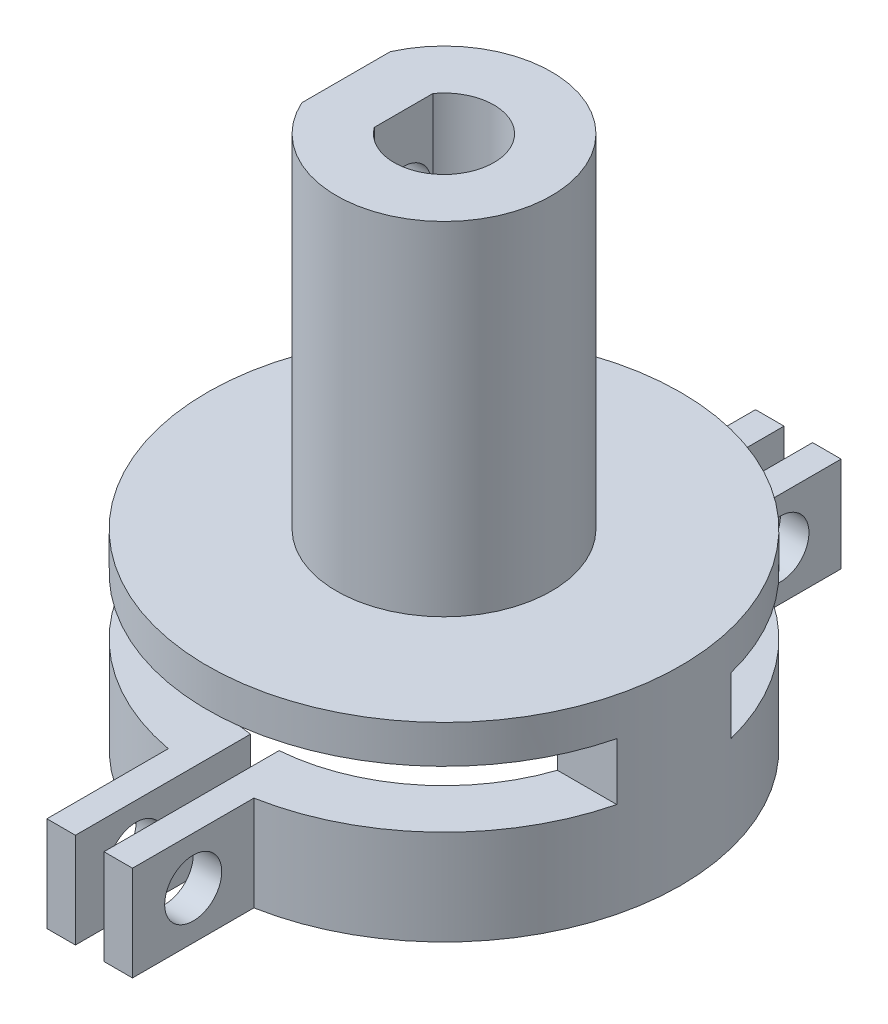
ISO-10303-21;
HEADER;
FILE_DESCRIPTION(('STEP AP214'),'2;1');
FILE_NAME('part.step','',(''),(''),'','','');
FILE_SCHEMA(('AUTOMOTIVE_DESIGN { 1 0 10303 214 1 1 1 1 }'));
ENDSEC;
DATA;
#1=APPLICATION_CONTEXT('core data for automotive mechanical design processes');
#2=APPLICATION_PROTOCOL_DEFINITION('international standard','automotive_design',2000,#1);
#3=PRODUCT_CONTEXT('',#1,'mechanical');
#4=PRODUCT('Part','Part','',(#3));
#5=PRODUCT_RELATED_PRODUCT_CATEGORY('part','',(#4));
#6=PRODUCT_DEFINITION_FORMATION('','',#4);
#7=PRODUCT_DEFINITION_CONTEXT('part definition',#1,'design');
#8=PRODUCT_DEFINITION('design','',#6,#7);
#9=PRODUCT_DEFINITION_SHAPE('','',#8);
#10=(LENGTH_UNIT() NAMED_UNIT(*) SI_UNIT(.MILLI.,.METRE.));
#11=(NAMED_UNIT(*) PLANE_ANGLE_UNIT() SI_UNIT($,.RADIAN.));
#12=(NAMED_UNIT(*) SI_UNIT($,.STERADIAN.) SOLID_ANGLE_UNIT());
#13=UNCERTAINTY_MEASURE_WITH_UNIT(LENGTH_MEASURE(1.E-05),#10,'distance_accuracy_value','');
#14=(GEOMETRIC_REPRESENTATION_CONTEXT(3) GLOBAL_UNCERTAINTY_ASSIGNED_CONTEXT((#13)) GLOBAL_UNIT_ASSIGNED_CONTEXT((#10,
#11,#12)) REPRESENTATION_CONTEXT('',''));
#15=CARTESIAN_POINT('',(0.,0.,0.));
#16=DIRECTION('',(0.,0.,1.));
#17=DIRECTION('',(1.,0.,0.));
#18=AXIS2_PLACEMENT_3D('',#15,#16,#17);
#19=CARTESIAN_POINT('',(0.,-2.,0.));
#20=DIRECTION('',(0.,1.,0.));
#21=DIRECTION('',(0.,0.,1.));
#22=AXIS2_PLACEMENT_3D('',#19,#20,#21);
#23=CYLINDRICAL_SURFACE('',#22,12.45);
#24=CARTESIAN_POINT('',(0.,0.,0.));
#25=DIRECTION('',(0.,-1.,0.));
#26=DIRECTION('',(0.,0.,-1.));
#27=AXIS2_PLACEMENT_3D('',#24,#25,#26);
#28=CIRCLE('',#27,12.45);
#29=CARTESIAN_POINT('',(0.,0.,-12.45));
#30=VERTEX_POINT('',#29);
#31=EDGE_CURVE('E424',#30,#30,#28,.T.);
#32=ORIENTED_EDGE('',*,*,#31,.T.);
#33=EDGE_LOOP('',(#32));
#34=FACE_BOUND('',#33,.T.);
#35=CARTESIAN_POINT('',(0.,-10.,0.));
#36=DIRECTION('',(0.,-1.,0.));
#37=DIRECTION('',(0.,0.,-1.));
#38=AXIS2_PLACEMENT_3D('',#35,#36,#37);
#39=CIRCLE('',#38,12.45);
#40=CARTESIAN_POINT('',(2.25000000000001,-10.,-12.2449989791751));
#41=VERTEX_POINT('',#40);
#42=CARTESIAN_POINT('',(2.25000000000001,-10.,12.2449989791751));
#43=VERTEX_POINT('',#42);
#44=EDGE_CURVE('E423',#41,#43,#39,.T.);
#45=ORIENTED_EDGE('',*,*,#44,.F.);
#46=DIRECTION('',(0.,-1.,0.));
#47=VECTOR('',#46,1.);
#48=CARTESIAN_POINT('',(2.25000000000001,1.55628734385074,-12.2449989791751));
#49=LINE('',#48,#47);
#50=CARTESIAN_POINT('',(2.25000000000001,-5.,-12.2449989791751));
#51=VERTEX_POINT('',#50);
#52=EDGE_CURVE('E269',#51,#41,#49,.T.);
#53=ORIENTED_EDGE('',*,*,#52,.F.);
#54=CARTESIAN_POINT('',(0.,-5.,0.));
#55=DIRECTION('',(0.,-1.,0.));
#56=DIRECTION('',(0.,0.,-1.));
#57=AXIS2_PLACEMENT_3D('',#54,#55,#56);
#58=CIRCLE('',#57,12.45);
#59=CARTESIAN_POINT('',(12.0831494238878,-5.,-3.));
#60=VERTEX_POINT('',#59);
#61=EDGE_CURVE('E401',#51,#60,#58,.T.);
#62=ORIENTED_EDGE('',*,*,#61,.T.);
#63=DIRECTION('',(0.,1.,0.));
#64=VECTOR('',#63,1.);
#65=CARTESIAN_POINT('',(12.0831494238878,-5.,-3.));
#66=LINE('',#65,#64);
#67=CARTESIAN_POINT('',(12.0831494238878,-2.,-3.));
#68=VERTEX_POINT('',#67);
#69=EDGE_CURVE('E386',#60,#68,#66,.T.);
#70=ORIENTED_EDGE('',*,*,#69,.T.);
#71=CARTESIAN_POINT('',(0.,-2.,0.));
#72=DIRECTION('',(0.,-1.,0.));
#73=DIRECTION('',(0.,0.,-1.));
#74=AXIS2_PLACEMENT_3D('',#71,#72,#73);
#75=CIRCLE('',#74,12.45);
#76=CARTESIAN_POINT('',(-12.0831494238878,-2.,-3.));
#77=VERTEX_POINT('',#76);
#78=EDGE_CURVE('E396',#77,#68,#75,.T.);
#79=ORIENTED_EDGE('',*,*,#78,.F.);
#80=DIRECTION('',(0.,1.,0.));
#81=VECTOR('',#80,1.);
#82=CARTESIAN_POINT('',(-12.0831494238878,-5.,-3.));
#83=LINE('',#82,#81);
#84=CARTESIAN_POINT('',(-12.0831494238878,-5.,-3.));
#85=VERTEX_POINT('',#84);
#86=EDGE_CURVE('E389',#85,#77,#83,.T.);
#87=ORIENTED_EDGE('',*,*,#86,.F.);
#88=CARTESIAN_POINT('',(-2.25,-5.,-12.2449989791751));
#89=VERTEX_POINT('',#88);
#90=EDGE_CURVE('E65',#85,#89,#58,.T.);
#91=ORIENTED_EDGE('',*,*,#90,.T.);
#92=DIRECTION('',(0.,-1.,0.));
#93=VECTOR('',#92,1.);
#94=CARTESIAN_POINT('',(-2.25,1.55628734385074,-12.2449989791751));
#95=LINE('',#94,#93);
#96=CARTESIAN_POINT('',(-2.25,-10.,-12.2449989791751));
#97=VERTEX_POINT('',#96);
#98=EDGE_CURVE('E60',#89,#97,#95,.T.);
#99=ORIENTED_EDGE('',*,*,#98,.T.);
#100=CARTESIAN_POINT('',(-2.25,-10.,12.2449989791751));
#101=VERTEX_POINT('',#100);
#102=EDGE_CURVE('E422',#101,#97,#39,.T.);
#103=ORIENTED_EDGE('',*,*,#102,.F.);
#104=DIRECTION('',(0.,-1.,0.));
#105=VECTOR('',#104,1.);
#106=CARTESIAN_POINT('',(-2.25,1.55628734385074,12.2449989791751));
#107=LINE('',#106,#105);
#108=CARTESIAN_POINT('',(-2.25,-5.,12.2449989791751));
#109=VERTEX_POINT('',#108);
#110=EDGE_CURVE('E325',#109,#101,#107,.T.);
#111=ORIENTED_EDGE('',*,*,#110,.F.);
#112=CARTESIAN_POINT('',(0.,-5.,0.));
#113=DIRECTION('',(0.,-1.,0.));
#114=DIRECTION('',(0.,0.,-1.));
#115=AXIS2_PLACEMENT_3D('',#112,#113,#114);
#116=CIRCLE('',#115,12.45);
#117=CARTESIAN_POINT('',(-12.0831494238878,-5.,3.00000000000001));
#118=VERTEX_POINT('',#117);
#119=EDGE_CURVE('E357',#109,#118,#116,.T.);
#120=ORIENTED_EDGE('',*,*,#119,.T.);
#121=DIRECTION('',(0.,1.,0.));
#122=VECTOR('',#121,1.);
#123=CARTESIAN_POINT('',(-12.0831494238878,-5.,3.00000000000001));
#124=LINE('',#123,#122);
#125=CARTESIAN_POINT('',(-12.0831494238878,-2.,3.00000000000001));
#126=VERTEX_POINT('',#125);
#127=EDGE_CURVE('E377',#118,#126,#124,.T.);
#128=ORIENTED_EDGE('',*,*,#127,.T.);
#129=CARTESIAN_POINT('',(0.,-2.,0.));
#130=DIRECTION('',(0.,-1.,0.));
#131=DIRECTION('',(0.,0.,-1.));
#132=AXIS2_PLACEMENT_3D('',#129,#130,#131);
#133=CIRCLE('',#132,12.45);
#134=CARTESIAN_POINT('',(12.0831494238878,-2.,3.));
#135=VERTEX_POINT('',#134);
#136=EDGE_CURVE('E365',#135,#126,#133,.T.);
#137=ORIENTED_EDGE('',*,*,#136,.F.);
#138=DIRECTION('',(0.,1.,0.));
#139=VECTOR('',#138,1.);
#140=CARTESIAN_POINT('',(12.0831494238878,-5.,3.));
#141=LINE('',#140,#139);
#142=CARTESIAN_POINT('',(12.0831494238878,-5.,3.));
#143=VERTEX_POINT('',#142);
#144=EDGE_CURVE('E375',#143,#135,#141,.T.);
#145=ORIENTED_EDGE('',*,*,#144,.F.);
#146=CARTESIAN_POINT('',(2.25000000000001,-5.,12.2449989791751));
#147=VERTEX_POINT('',#146);
#148=EDGE_CURVE('E358',#143,#147,#116,.T.);
#149=ORIENTED_EDGE('',*,*,#148,.T.);
#150=DIRECTION('',(0.,-1.,0.));
#151=VECTOR('',#150,1.);
#152=CARTESIAN_POINT('',(2.25000000000001,1.55628734385074,12.2449989791751));
#153=LINE('',#152,#151);
#154=EDGE_CURVE('E302',#147,#43,#153,.T.);
#155=ORIENTED_EDGE('',*,*,#154,.T.);
#156=EDGE_LOOP('',(#45,#53,#62,#70,#79,#87,#91,#99,#103,#111,#120,#128,#137,#145,#149,#155));
#157=FACE_BOUND('',#156,.T.);
#158=ADVANCED_FACE('F43',(#34,#157),#23,.T.);
#159=CARTESIAN_POINT('',(0.,-10.,0.));
#160=DIRECTION('',(0.,1.,0.));
#161=DIRECTION('',(0.,0.,1.));
#162=AXIS2_PLACEMENT_3D('',#159,#160,#161);
#163=CYLINDRICAL_SURFACE('',#162,9.45);
#164=DIRECTION('',(0.,-1.,0.));
#165=VECTOR('',#164,1.);
#166=CARTESIAN_POINT('',(0.75,18.001,-9.42019108086455));
#167=LINE('',#166,#165);
#168=CARTESIAN_POINT('',(0.75,-5.,-9.42019108086455));
#169=VERTEX_POINT('',#168);
#170=CARTESIAN_POINT('',(0.75,-10.,-9.42019108086455));
#171=VERTEX_POINT('',#170);
#172=EDGE_CURVE('E333',#169,#171,#167,.T.);
#173=ORIENTED_EDGE('',*,*,#172,.T.);
#174=CARTESIAN_POINT('',(0.,-10.,0.));
#175=DIRECTION('',(0.,-1.,0.));
#176=DIRECTION('',(0.,0.,-1.));
#177=AXIS2_PLACEMENT_3D('',#174,#175,#176);
#178=CIRCLE('',#177,9.45);
#179=CARTESIAN_POINT('',(0.75,-10.,9.42019108086455));
#180=VERTEX_POINT('',#179);
#181=EDGE_CURVE('E240',#171,#180,#178,.T.);
#182=ORIENTED_EDGE('',*,*,#181,.T.);
#183=DIRECTION('',(0.,-1.,0.));
#184=VECTOR('',#183,1.);
#185=CARTESIAN_POINT('',(0.75,18.001,9.42019108086455));
#186=LINE('',#185,#184);
#187=CARTESIAN_POINT('',(0.75,-5.,9.42019108086455));
#188=VERTEX_POINT('',#187);
#189=EDGE_CURVE('E340',#188,#180,#186,.T.);
#190=ORIENTED_EDGE('',*,*,#189,.F.);
#191=CARTESIAN_POINT('',(0.,-5.,0.));
#192=DIRECTION('',(0.,-1.,0.));
#193=DIRECTION('',(0.,0.,-1.));
#194=AXIS2_PLACEMENT_3D('',#191,#192,#193);
#195=CIRCLE('',#194,9.45);
#196=CARTESIAN_POINT('',(8.96116621874631,-5.,3.));
#197=VERTEX_POINT('',#196);
#198=EDGE_CURVE('E350',#197,#188,#195,.T.);
#199=ORIENTED_EDGE('',*,*,#198,.F.);
#200=DIRECTION('',(0.,1.,0.));
#201=VECTOR('',#200,1.);
#202=CARTESIAN_POINT('',(8.96116621874631,-5.,3.));
#203=LINE('',#202,#201);
#204=CARTESIAN_POINT('',(8.96116621874631,-2.,3.));
#205=VERTEX_POINT('',#204);
#206=EDGE_CURVE('E371',#197,#205,#203,.T.);
#207=ORIENTED_EDGE('',*,*,#206,.T.);
#208=CARTESIAN_POINT('',(0.,-2.,0.));
#209=DIRECTION('',(0.,-1.,0.));
#210=DIRECTION('',(0.,0.,-1.));
#211=AXIS2_PLACEMENT_3D('',#208,#209,#210);
#212=CIRCLE('',#211,9.45);
#213=CARTESIAN_POINT('',(8.96116621874631,-2.,-3.));
#214=VERTEX_POINT('',#213);
#215=EDGE_CURVE('E52',#205,#214,#212,.F.);
#216=ORIENTED_EDGE('',*,*,#215,.T.);
#217=DIRECTION('',(0.,1.,0.));
#218=VECTOR('',#217,1.);
#219=CARTESIAN_POINT('',(8.96116621874631,-5.,-3.));
#220=LINE('',#219,#218);
#221=CARTESIAN_POINT('',(8.96116621874631,-5.,-3.));
#222=VERTEX_POINT('',#221);
#223=EDGE_CURVE('E382',#222,#214,#220,.T.);
#224=ORIENTED_EDGE('',*,*,#223,.F.);
#225=CARTESIAN_POINT('',(0.,-5.,0.));
#226=DIRECTION('',(0.,-1.,0.));
#227=DIRECTION('',(0.,0.,-1.));
#228=AXIS2_PLACEMENT_3D('',#225,#226,#227);
#229=CIRCLE('',#228,9.45);
#230=EDGE_CURVE('E406',#169,#222,#229,.T.);
#231=ORIENTED_EDGE('',*,*,#230,.F.);
#232=EDGE_LOOP('',(#173,#182,#190,#199,#207,#216,#224,#231));
#233=FACE_BOUND('',#232,.T.);
#234=ADVANCED_FACE('F505',(#233),#163,.F.);
#235=CARTESIAN_POINT('',(0.,-10.,0.));
#236=DIRECTION('',(0.,-1.,0.));
#237=DIRECTION('',(0.,0.,-1.));
#238=AXIS2_PLACEMENT_3D('',#235,#236,#237);
#239=PLANE('',#238);
#240=DIRECTION('',(0.,0.,1.));
#241=VECTOR('',#240,1.);
#242=CARTESIAN_POINT('',(0.75,-10.,-9.42019108086455));
#243=LINE('',#242,#241);
#244=CARTESIAN_POINT('',(0.75000000000001,-10.,-18.6273891063248));
#245=VERTEX_POINT('',#244);
#246=EDGE_CURVE('E231',#245,#171,#243,.T.);
#247=ORIENTED_EDGE('',*,*,#246,.F.);
#248=DIRECTION('',(1.,0.,0.));
#249=VECTOR('',#248,1.);
#250=CARTESIAN_POINT('',(0.,-10.,-18.6273891063248));
#251=LINE('',#250,#249);
#252=CARTESIAN_POINT('',(2.25000000000001,-10.,-18.6273891063248));
#253=VERTEX_POINT('',#252);
#254=EDGE_CURVE('E236',#245,#253,#251,.T.);
#255=ORIENTED_EDGE('',*,*,#254,.T.);
#256=DIRECTION('',(0.,0.,1.));
#257=VECTOR('',#256,1.);
#258=CARTESIAN_POINT('',(2.25,-10.,0.));
#259=LINE('',#258,#257);
#260=EDGE_CURVE('E255',#253,#41,#259,.T.);
#261=ORIENTED_EDGE('',*,*,#260,.T.);
#262=ORIENTED_EDGE('',*,*,#44,.T.);
#263=DIRECTION('',(0.,0.,-1.));
#264=VECTOR('',#263,1.);
#265=CARTESIAN_POINT('',(2.25,-10.,0.));
#266=LINE('',#265,#264);
#267=CARTESIAN_POINT('',(2.25000000000001,-10.,18.6273891063248));
#268=VERTEX_POINT('',#267);
#269=EDGE_CURVE('E280',#268,#43,#266,.T.);
#270=ORIENTED_EDGE('',*,*,#269,.F.);
#271=DIRECTION('',(1.,0.,0.));
#272=VECTOR('',#271,1.);
#273=CARTESIAN_POINT('',(0.,-10.,18.6273891063248));
#274=LINE('',#273,#272);
#275=CARTESIAN_POINT('',(0.75000000000001,-10.,18.6273891063248));
#276=VERTEX_POINT('',#275);
#277=EDGE_CURVE('E299',#276,#268,#274,.T.);
#278=ORIENTED_EDGE('',*,*,#277,.F.);
#279=DIRECTION('',(0.,0.,1.));
#280=VECTOR('',#279,1.);
#281=CARTESIAN_POINT('',(0.75,-10.,9.42019108086455));
#282=LINE('',#281,#280);
#283=EDGE_CURVE('E344',#180,#276,#282,.T.);
#284=ORIENTED_EDGE('',*,*,#283,.F.);
#285=ORIENTED_EDGE('',*,*,#181,.F.);
#286=EDGE_LOOP('',(#247,#255,#261,#262,#270,#278,#284,#285));
#287=FACE_BOUND('',#286,.T.);
#288=ADVANCED_FACE('F233',(#287),#239,.T.);
#289=CARTESIAN_POINT('',(0.,-5.,0.));
#290=DIRECTION('',(0.,-1.,0.));
#291=DIRECTION('',(0.,0.,-1.));
#292=AXIS2_PLACEMENT_3D('',#289,#290,#291);
#293=PLANE('',#292);
#294=ORIENTED_EDGE('',*,*,#61,.F.);
#295=DIRECTION('',(0.,0.,-1.));
#296=VECTOR('',#295,1.);
#297=CARTESIAN_POINT('',(2.25,-5.,0.));
#298=LINE('',#297,#296);
#299=CARTESIAN_POINT('',(2.25000000000001,-5.,-18.6273891063248));
#300=VERTEX_POINT('',#299);
#301=EDGE_CURVE('E266',#51,#300,#298,.T.);
#302=ORIENTED_EDGE('',*,*,#301,.T.);
#303=DIRECTION('',(-1.,0.,0.));
#304=VECTOR('',#303,1.);
#305=CARTESIAN_POINT('',(0.,-5.,-18.6273891063248));
#306=LINE('',#305,#304);
#307=CARTESIAN_POINT('',(0.75000000000001,-5.,-18.6273891063248));
#308=VERTEX_POINT('',#307);
#309=EDGE_CURVE('E271',#300,#308,#306,.T.);
#310=ORIENTED_EDGE('',*,*,#309,.T.);
#311=DIRECTION('',(0.,0.,-1.));
#312=VECTOR('',#311,1.);
#313=CARTESIAN_POINT('',(0.75,-5.,-9.42019108086455));
#314=LINE('',#313,#312);
#315=EDGE_CURVE('E250',#169,#308,#314,.T.);
#316=ORIENTED_EDGE('',*,*,#315,.F.);
#317=ORIENTED_EDGE('',*,*,#230,.T.);
#318=DIRECTION('',(-1.,0.,0.));
#319=VECTOR('',#318,1.);
#320=CARTESIAN_POINT('',(0.,-5.,-3.));
#321=LINE('',#320,#319);
#322=EDGE_CURVE('E403',#60,#222,#321,.T.);
#323=ORIENTED_EDGE('',*,*,#322,.F.);
#324=EDGE_LOOP('',(#294,#302,#310,#316,#317,#323));
#325=FACE_BOUND('',#324,.T.);
#326=ADVANCED_FACE('F482',(#325),#293,.F.);
#327=CARTESIAN_POINT('',(0.,-5.,0.));
#328=DIRECTION('',(0.,-1.,0.));
#329=DIRECTION('',(0.,0.,-1.));
#330=AXIS2_PLACEMENT_3D('',#327,#328,#329);
#331=PLANE('',#330);
#332=ORIENTED_EDGE('',*,*,#119,.F.);
#333=DIRECTION('',(0.,0.,1.));
#334=VECTOR('',#333,1.);
#335=CARTESIAN_POINT('',(-2.25,-5.,0.));
#336=LINE('',#335,#334);
#337=CARTESIAN_POINT('',(-2.25,-5.,18.6273891063248));
#338=VERTEX_POINT('',#337);
#339=EDGE_CURVE('E315',#109,#338,#336,.T.);
#340=ORIENTED_EDGE('',*,*,#339,.T.);
#341=DIRECTION('',(1.,0.,0.));
#342=VECTOR('',#341,1.);
#343=CARTESIAN_POINT('',(0.,-5.,18.6273891063248));
#344=LINE('',#343,#342);
#345=CARTESIAN_POINT('',(-0.75,-5.,18.6273891063248));
#346=VERTEX_POINT('',#345);
#347=EDGE_CURVE('E312',#338,#346,#344,.T.);
#348=ORIENTED_EDGE('',*,*,#347,.T.);
#349=DIRECTION('',(0.,0.,1.));
#350=VECTOR('',#349,1.);
#351=CARTESIAN_POINT('',(-0.75,-5.,9.42019108086455));
#352=LINE('',#351,#350);
#353=CARTESIAN_POINT('',(-0.749999999999998,-5.,9.42019108086455));
#354=VERTEX_POINT('',#353);
#355=EDGE_CURVE('E329',#354,#346,#352,.T.);
#356=ORIENTED_EDGE('',*,*,#355,.F.);
#357=CARTESIAN_POINT('',(-8.96116621874631,-5.,3.));
#358=VERTEX_POINT('',#357);
#359=EDGE_CURVE('E354',#354,#358,#195,.T.);
#360=ORIENTED_EDGE('',*,*,#359,.T.);
#361=DIRECTION('',(1.,0.,0.));
#362=VECTOR('',#361,1.);
#363=CARTESIAN_POINT('',(0.,-5.,3.));
#364=LINE('',#363,#362);
#365=EDGE_CURVE('E353',#118,#358,#364,.T.);
#366=ORIENTED_EDGE('',*,*,#365,.F.);
#367=EDGE_LOOP('',(#332,#340,#348,#356,#360,#366));
#368=FACE_BOUND('',#367,.T.);
#369=ADVANCED_FACE('F551',(#368),#331,.F.);
#370=DIRECTION('',(0.,-1.,0.));
#371=VECTOR('',#370,1.);
#372=CARTESIAN_POINT('',(-0.750000000000005,18.001,-9.42019108086455));
#373=LINE('',#372,#371);
#374=CARTESIAN_POINT('',(-0.750000000000005,-5.,-9.42019108086455));
#375=VERTEX_POINT('',#374);
#376=CARTESIAN_POINT('',(-0.750000000000005,-10.,-9.42019108086455));
#377=VERTEX_POINT('',#376);
#378=EDGE_CURVE('E334',#375,#377,#373,.T.);
#379=ORIENTED_EDGE('',*,*,#378,.F.);
#380=CARTESIAN_POINT('',(-8.96116621874631,-5.,-3.));
#381=VERTEX_POINT('',#380);
#382=EDGE_CURVE('E397',#381,#375,#229,.T.);
#383=ORIENTED_EDGE('',*,*,#382,.F.);
#384=DIRECTION('',(0.,1.,0.));
#385=VECTOR('',#384,1.);
#386=CARTESIAN_POINT('',(-8.96116621874631,-5.,-3.));
#387=LINE('',#386,#385);
#388=CARTESIAN_POINT('',(-8.96116621874631,-2.,-3.));
#389=VERTEX_POINT('',#388);
#390=EDGE_CURVE('E338',#381,#389,#387,.T.);
#391=ORIENTED_EDGE('',*,*,#390,.T.);
#392=CARTESIAN_POINT('',(-8.96116621874631,-2.,3.));
#393=VERTEX_POINT('',#392);
#394=EDGE_CURVE('E11',#389,#393,#212,.F.);
#395=ORIENTED_EDGE('',*,*,#394,.T.);
#396=DIRECTION('',(0.,1.,0.));
#397=VECTOR('',#396,1.);
#398=CARTESIAN_POINT('',(-8.96116621874631,-5.,3.));
#399=LINE('',#398,#397);
#400=EDGE_CURVE('E362',#358,#393,#399,.T.);
#401=ORIENTED_EDGE('',*,*,#400,.F.);
#402=ORIENTED_EDGE('',*,*,#359,.F.);
#403=DIRECTION('',(0.,-1.,0.));
#404=VECTOR('',#403,1.);
#405=CARTESIAN_POINT('',(-0.749999999999998,18.001,9.42019108086455));
#406=LINE('',#405,#404);
#407=CARTESIAN_POINT('',(-0.749999999999998,-10.,9.42019108086455));
#408=VERTEX_POINT('',#407);
#409=EDGE_CURVE('E341',#354,#408,#406,.T.);
#410=ORIENTED_EDGE('',*,*,#409,.T.);
#411=EDGE_CURVE('E412',#408,#377,#178,.T.);
#412=ORIENTED_EDGE('',*,*,#411,.T.);
#413=EDGE_LOOP('',(#379,#383,#391,#395,#401,#402,#410,#412));
#414=FACE_BOUND('',#413,.T.);
#415=ADVANCED_FACE('F531',(#414),#163,.F.);
#416=CARTESIAN_POINT('',(0.,18.,0.));
#417=DIRECTION('',(0.,1.,0.));
#418=DIRECTION('',(0.,0.,1.));
#419=AXIS2_PLACEMENT_3D('',#416,#417,#418);
#420=PLANE('',#419);
#421=CARTESIAN_POINT('',(0.,18.,0.));
#422=DIRECTION('',(0.,1.,0.));
#423=DIRECTION('',(0.,0.,1.));
#424=AXIS2_PLACEMENT_3D('',#421,#422,#423);
#425=CIRCLE('',#424,5.65);
#426=CARTESIAN_POINT('',(-5.14941852602047,18.,2.32507824467849));
#427=VERTEX_POINT('',#426);
#428=CARTESIAN_POINT('',(-5.14941852602047,18.,-2.32507824467849));
#429=VERTEX_POINT('',#428);
#430=EDGE_CURVE('E445',#427,#429,#425,.T.);
#431=ORIENTED_EDGE('',*,*,#430,.T.);
#432=DIRECTION('',(0.,0.,1.));
#433=VECTOR('',#432,1.);
#434=CARTESIAN_POINT('',(-5.14941852602047,18.,-2.32507824467849));
#435=LINE('',#434,#433);
#436=EDGE_CURVE('E448',#429,#427,#435,.T.);
#437=ORIENTED_EDGE('',*,*,#436,.T.);
#438=EDGE_LOOP('',(#431,#437));
#439=FACE_BOUND('',#438,.T.);
#440=DIRECTION('',(0.,0.,1.));
#441=VECTOR('',#440,1.);
#442=CARTESIAN_POINT('',(-2.12441852602047,18.,-1.54190496668926));
#443=LINE('',#442,#441);
#444=CARTESIAN_POINT('',(-2.12441852602047,18.,-1.54190496668926));
#445=VERTEX_POINT('',#444);
#446=CARTESIAN_POINT('',(-2.12441852602047,18.,1.54190496668926));
#447=VERTEX_POINT('',#446);
#448=EDGE_CURVE('E432',#445,#447,#443,.T.);
#449=ORIENTED_EDGE('',*,*,#448,.F.);
#450=CARTESIAN_POINT('',(0.,18.,0.));
#451=DIRECTION('',(0.,1.,0.));
#452=DIRECTION('',(0.,0.,1.));
#453=AXIS2_PLACEMENT_3D('',#450,#451,#452);
#454=CIRCLE('',#453,2.625);
#455=EDGE_CURVE('E429',#447,#445,#454,.T.);
#456=ORIENTED_EDGE('',*,*,#455,.F.);
#457=EDGE_LOOP('',(#449,#456));
#458=FACE_BOUND('',#457,.T.);
#459=ADVANCED_FACE('F588',(#439,#458),#420,.T.);
#460=CARTESIAN_POINT('',(0.,18.,0.));
#461=DIRECTION('',(0.,-1.,0.));
#462=DIRECTION('',(0.,0.,-1.));
#463=AXIS2_PLACEMENT_3D('',#460,#461,#462);
#464=CYLINDRICAL_SURFACE('',#463,5.65);
#465=CARTESIAN_POINT('',(0.,0.,0.));
#466=DIRECTION('',(0.,1.,0.));
#467=DIRECTION('',(0.,0.,1.));
#468=AXIS2_PLACEMENT_3D('',#465,#466,#467);
#469=CIRCLE('',#468,5.65);
#470=CARTESIAN_POINT('',(-5.14941852602047,0.,2.32507824467849));
#471=VERTEX_POINT('',#470);
#472=CARTESIAN_POINT('',(-5.14941852602047,0.,-2.32507824467849));
#473=VERTEX_POINT('',#472);
#474=EDGE_CURVE('E444',#471,#473,#469,.T.);
#475=ORIENTED_EDGE('',*,*,#474,.T.);
#476=DIRECTION('',(0.,-1.,0.));
#477=VECTOR('',#476,1.);
#478=CARTESIAN_POINT('',(-5.14941852602047,18.,-2.32507824467849));
#479=LINE('',#478,#477);
#480=EDGE_CURVE('E458',#429,#473,#479,.T.);
#481=ORIENTED_EDGE('',*,*,#480,.F.);
#482=ORIENTED_EDGE('',*,*,#430,.F.);
#483=DIRECTION('',(0.,-1.,0.));
#484=VECTOR('',#483,1.);
#485=CARTESIAN_POINT('',(-5.14941852602047,18.,2.32507824467849));
#486=LINE('',#485,#484);
#487=EDGE_CURVE('E451',#427,#471,#486,.T.);
#488=ORIENTED_EDGE('',*,*,#487,.T.);
#489=EDGE_LOOP('',(#475,#481,#482,#488));
#490=FACE_BOUND('',#489,.T.);
#491=ADVANCED_FACE('F45',(#490),#464,.T.);
#492=CARTESIAN_POINT('',(-5.14941852602047,18.,-2.32507824467849));
#493=DIRECTION('',(1.,0.,0.));
#494=DIRECTION('',(0.,0.,-1.));
#495=AXIS2_PLACEMENT_3D('',#492,#493,#494);
#496=PLANE('',#495);
#497=CARTESIAN_POINT('',(-5.14941852602047,14.,0.));
#498=DIRECTION('',(-1.,0.,0.));
#499=DIRECTION('',(0.,0.,1.));
#500=AXIS2_PLACEMENT_3D('',#497,#498,#499);
#501=CIRCLE('',#500,1.45);
#502=CARTESIAN_POINT('',(-5.14941852602047,14.,1.45));
#503=VERTEX_POINT('',#502);
#504=EDGE_CURVE('E409',#503,#503,#501,.T.);
#505=ORIENTED_EDGE('',*,*,#504,.F.);
#506=EDGE_LOOP('',(#505));
#507=FACE_BOUND('',#506,.T.);
#508=CARTESIAN_POINT('',(-5.14941852602047,4.,0.));
#509=DIRECTION('',(-1.,0.,0.));
#510=DIRECTION('',(0.,0.,1.));
#511=AXIS2_PLACEMENT_3D('',#508,#509,#510);
#512=CIRCLE('',#511,1.45);
#513=CARTESIAN_POINT('',(-5.14941852602047,4.,1.45));
#514=VERTEX_POINT('',#513);
#515=EDGE_CURVE('E374',#514,#514,#512,.T.);
#516=ORIENTED_EDGE('',*,*,#515,.F.);
#517=EDGE_LOOP('',(#516));
#518=FACE_BOUND('',#517,.T.);
#519=DIRECTION('',(0.,0.,1.));
#520=VECTOR('',#519,1.);
#521=CARTESIAN_POINT('',(-5.14941852602047,0.,-2.32507824467849));
#522=LINE('',#521,#520);
#523=EDGE_CURVE('E449',#473,#471,#522,.T.);
#524=ORIENTED_EDGE('',*,*,#523,.T.);
#525=ORIENTED_EDGE('',*,*,#487,.F.);
#526=ORIENTED_EDGE('',*,*,#436,.F.);
#527=ORIENTED_EDGE('',*,*,#480,.T.);
#528=EDGE_LOOP('',(#524,#525,#526,#527));
#529=FACE_BOUND('',#528,.T.);
#530=ADVANCED_FACE('F586',(#507,#518,#529),#496,.F.);
#531=CARTESIAN_POINT('',(0.,18.,0.));
#532=DIRECTION('',(0.,-1.,0.));
#533=DIRECTION('',(0.,0.,-1.));
#534=AXIS2_PLACEMENT_3D('',#531,#532,#533);
#535=CYLINDRICAL_SURFACE('',#534,2.625);
#536=CARTESIAN_POINT('',(0.,0.,0.));
#537=DIRECTION('',(0.,1.,0.));
#538=DIRECTION('',(0.,0.,1.));
#539=AXIS2_PLACEMENT_3D('',#536,#537,#538);
#540=CIRCLE('',#539,2.625);
#541=CARTESIAN_POINT('',(-2.12441852602047,0.,1.54190496668926));
#542=VERTEX_POINT('',#541);
#543=CARTESIAN_POINT('',(-2.12441852602047,0.,-1.54190496668926));
#544=VERTEX_POINT('',#543);
#545=EDGE_CURVE('E428',#542,#544,#540,.T.);
#546=ORIENTED_EDGE('',*,*,#545,.F.);
#547=DIRECTION('',(0.,-1.,0.));
#548=VECTOR('',#547,1.);
#549=CARTESIAN_POINT('',(-2.12441852602047,18.,1.54190496668926));
#550=LINE('',#549,#548);
#551=EDGE_CURVE('E435',#447,#542,#550,.T.);
#552=ORIENTED_EDGE('',*,*,#551,.F.);
#553=ORIENTED_EDGE('',*,*,#455,.T.);
#554=DIRECTION('',(0.,-1.,0.));
#555=VECTOR('',#554,1.);
#556=CARTESIAN_POINT('',(-2.12441852602047,18.,-1.54190496668926));
#557=LINE('',#556,#555);
#558=EDGE_CURVE('E441',#445,#544,#557,.T.);
#559=ORIENTED_EDGE('',*,*,#558,.T.);
#560=EDGE_LOOP('',(#546,#552,#553,#559));
#561=FACE_BOUND('',#560,.T.);
#562=ADVANCED_FACE('F582',(#561),#535,.F.);
#563=CARTESIAN_POINT('',(-2.12441852602047,18.,-1.54190496668926));
#564=DIRECTION('',(1.,0.,0.));
#565=DIRECTION('',(0.,0.,-1.));
#566=AXIS2_PLACEMENT_3D('',#563,#564,#565);
#567=PLANE('',#566);
#568=CARTESIAN_POINT('',(-2.12441852602047,14.,0.));
#569=DIRECTION('',(1.,0.,0.));
#570=DIRECTION('',(0.,0.,-1.));
#571=AXIS2_PLACEMENT_3D('',#568,#569,#570);
#572=CIRCLE('',#571,1.45);
#573=CARTESIAN_POINT('',(-2.12441852602047,14.,-1.45));
#574=VERTEX_POINT('',#573);
#575=EDGE_CURVE('E413',#574,#574,#572,.F.);
#576=ORIENTED_EDGE('',*,*,#575,.T.);
#577=EDGE_LOOP('',(#576));
#578=FACE_BOUND('',#577,.T.);
#579=CARTESIAN_POINT('',(-2.12441852602047,4.,0.));
#580=DIRECTION('',(1.,0.,0.));
#581=DIRECTION('',(0.,0.,-1.));
#582=AXIS2_PLACEMENT_3D('',#579,#580,#581);
#583=CIRCLE('',#582,1.45);
#584=CARTESIAN_POINT('',(-2.12441852602047,4.,-1.45));
#585=VERTEX_POINT('',#584);
#586=EDGE_CURVE('E416',#585,#585,#583,.F.);
#587=ORIENTED_EDGE('',*,*,#586,.T.);
#588=EDGE_LOOP('',(#587));
#589=FACE_BOUND('',#588,.T.);
#590=DIRECTION('',(0.,0.,1.));
#591=VECTOR('',#590,1.);
#592=CARTESIAN_POINT('',(-2.12441852602047,0.,-1.54190496668926));
#593=LINE('',#592,#591);
#594=EDGE_CURVE('E433',#544,#542,#593,.T.);
#595=ORIENTED_EDGE('',*,*,#594,.F.);
#596=ORIENTED_EDGE('',*,*,#558,.F.);
#597=ORIENTED_EDGE('',*,*,#448,.T.);
#598=ORIENTED_EDGE('',*,*,#551,.T.);
#599=EDGE_LOOP('',(#595,#596,#597,#598));
#600=FACE_BOUND('',#599,.T.);
#601=ADVANCED_FACE('F578',(#578,#589,#600),#567,.T.);
#602=CARTESIAN_POINT('',(0.,0.,0.));
#603=DIRECTION('',(0.,-1.,0.));
#604=DIRECTION('',(0.,0.,-1.));
#605=AXIS2_PLACEMENT_3D('',#602,#603,#604);
#606=PLANE('',#605);
#607=ORIENTED_EDGE('',*,*,#594,.T.);
#608=ORIENTED_EDGE('',*,*,#545,.T.);
#609=EDGE_LOOP('',(#607,#608));
#610=FACE_BOUND('',#609,.T.);
#611=ADVANCED_FACE('F581',(#610),#606,.F.);
#612=ORIENTED_EDGE('',*,*,#31,.F.);
#613=EDGE_LOOP('',(#612));
#614=FACE_BOUND('',#613,.T.);
#615=ORIENTED_EDGE('',*,*,#474,.F.);
#616=ORIENTED_EDGE('',*,*,#523,.F.);
#617=EDGE_LOOP('',(#615,#616));
#618=FACE_BOUND('',#617,.T.);
#619=ADVANCED_FACE('F576',(#614,#618),#606,.F.);
#620=DIRECTION('',(0.,0.,-1.));
#621=VECTOR('',#620,1.);
#622=CARTESIAN_POINT('',(-0.75,-10.,-9.42019108086455));
#623=LINE('',#622,#621);
#624=CARTESIAN_POINT('',(-0.75,-10.,-18.6273891063248));
#625=VERTEX_POINT('',#624);
#626=EDGE_CURVE('E243',#377,#625,#623,.T.);
#627=ORIENTED_EDGE('',*,*,#626,.F.);
#628=ORIENTED_EDGE('',*,*,#411,.F.);
#629=DIRECTION('',(0.,0.,-1.));
#630=VECTOR('',#629,1.);
#631=CARTESIAN_POINT('',(-0.75,-10.,9.42019108086455));
#632=LINE('',#631,#630);
#633=CARTESIAN_POINT('',(-0.75,-10.,18.6273891063248));
#634=VERTEX_POINT('',#633);
#635=EDGE_CURVE('E347',#634,#408,#632,.T.);
#636=ORIENTED_EDGE('',*,*,#635,.F.);
#637=DIRECTION('',(-1.,0.,0.));
#638=VECTOR('',#637,1.);
#639=CARTESIAN_POINT('',(0.,-10.,18.6273891063248));
#640=LINE('',#639,#638);
#641=CARTESIAN_POINT('',(-2.25,-10.,18.6273891063248));
#642=VERTEX_POINT('',#641);
#643=EDGE_CURVE('E295',#634,#642,#640,.T.);
#644=ORIENTED_EDGE('',*,*,#643,.T.);
#645=DIRECTION('',(0.,0.,-1.));
#646=VECTOR('',#645,1.);
#647=CARTESIAN_POINT('',(-2.25,-10.,0.));
#648=LINE('',#647,#646);
#649=EDGE_CURVE('E319',#642,#101,#648,.T.);
#650=ORIENTED_EDGE('',*,*,#649,.T.);
#651=ORIENTED_EDGE('',*,*,#102,.T.);
#652=DIRECTION('',(0.,0.,1.));
#653=VECTOR('',#652,1.);
#654=CARTESIAN_POINT('',(-2.25,-10.,0.));
#655=LINE('',#654,#653);
#656=CARTESIAN_POINT('',(-2.25,-10.,-18.6273891063248));
#657=VERTEX_POINT('',#656);
#658=EDGE_CURVE('E281',#657,#97,#655,.T.);
#659=ORIENTED_EDGE('',*,*,#658,.F.);
#660=DIRECTION('',(-1.,0.,0.));
#661=VECTOR('',#660,1.);
#662=CARTESIAN_POINT('',(0.,-10.,-18.6273891063248));
#663=LINE('',#662,#661);
#664=EDGE_CURVE('E284',#625,#657,#663,.T.);
#665=ORIENTED_EDGE('',*,*,#664,.F.);
#666=EDGE_LOOP('',(#627,#628,#636,#644,#650,#651,#659,#665));
#667=FACE_BOUND('',#666,.T.);
#668=ADVANCED_FACE('F543',(#667),#239,.T.);
#669=CARTESIAN_POINT('',(0.,-2.,0.));
#670=DIRECTION('',(0.,-1.,0.));
#671=DIRECTION('',(0.,0.,-1.));
#672=AXIS2_PLACEMENT_3D('',#669,#670,#671);
#673=PLANE('',#672);
#674=ORIENTED_EDGE('',*,*,#394,.F.);
#675=DIRECTION('',(-1.,0.,0.));
#676=VECTOR('',#675,1.);
#677=CARTESIAN_POINT('',(0.,-2.,-3.));
#678=LINE('',#677,#676);
#679=EDGE_CURVE('E393',#389,#77,#678,.T.);
#680=ORIENTED_EDGE('',*,*,#679,.T.);
#681=ORIENTED_EDGE('',*,*,#78,.T.);
#682=DIRECTION('',(-1.,0.,0.));
#683=VECTOR('',#682,1.);
#684=CARTESIAN_POINT('',(0.,-2.,-3.));
#685=LINE('',#684,#683);
#686=EDGE_CURVE('E366',#68,#214,#685,.T.);
#687=ORIENTED_EDGE('',*,*,#686,.T.);
#688=ORIENTED_EDGE('',*,*,#215,.F.);
#689=DIRECTION('',(1.,0.,0.));
#690=VECTOR('',#689,1.);
#691=CARTESIAN_POINT('',(0.,-2.,3.));
#692=LINE('',#691,#690);
#693=EDGE_CURVE('E368',#205,#135,#692,.T.);
#694=ORIENTED_EDGE('',*,*,#693,.T.);
#695=ORIENTED_EDGE('',*,*,#136,.T.);
#696=DIRECTION('',(1.,0.,0.));
#697=VECTOR('',#696,1.);
#698=CARTESIAN_POINT('',(0.,-2.,3.));
#699=LINE('',#698,#697);
#700=EDGE_CURVE('E363',#126,#393,#699,.T.);
#701=ORIENTED_EDGE('',*,*,#700,.T.);
#702=EDGE_LOOP('',(#674,#680,#681,#687,#688,#694,#695,#701));
#703=FACE_BOUND('',#702,.T.);
#704=ADVANCED_FACE('F516',(#703),#673,.T.);
#705=CARTESIAN_POINT('',(12.451,4.,0.));
#706=DIRECTION('',(-1.,0.,0.));
#707=DIRECTION('',(0.,0.,1.));
#708=AXIS2_PLACEMENT_3D('',#705,#706,#707);
#709=CYLINDRICAL_SURFACE('',#708,1.45);
#710=ORIENTED_EDGE('',*,*,#586,.F.);
#711=EDGE_LOOP('',(#710));
#712=FACE_BOUND('',#711,.T.);
#713=ORIENTED_EDGE('',*,*,#515,.T.);
#714=EDGE_LOOP('',(#713));
#715=FACE_BOUND('',#714,.T.);
#716=ADVANCED_FACE('F627',(#712,#715),#709,.F.);
#717=CARTESIAN_POINT('',(12.451,14.,0.));
#718=DIRECTION('',(-1.,0.,0.));
#719=DIRECTION('',(0.,0.,1.));
#720=AXIS2_PLACEMENT_3D('',#717,#718,#719);
#721=CYLINDRICAL_SURFACE('',#720,1.45);
#722=ORIENTED_EDGE('',*,*,#575,.F.);
#723=EDGE_LOOP('',(#722));
#724=FACE_BOUND('',#723,.T.);
#725=ORIENTED_EDGE('',*,*,#504,.T.);
#726=EDGE_LOOP('',(#725));
#727=FACE_BOUND('',#726,.T.);
#728=ADVANCED_FACE('F642',(#724,#727),#721,.F.);
#729=CARTESIAN_POINT('',(0.,-5.,-3.));
#730=DIRECTION('',(0.,0.,-1.));
#731=DIRECTION('',(-1.,0.,0.));
#732=AXIS2_PLACEMENT_3D('',#729,#730,#731);
#733=PLANE('',#732);
#734=ORIENTED_EDGE('',*,*,#679,.F.);
#735=ORIENTED_EDGE('',*,*,#390,.F.);
#736=DIRECTION('',(-1.,0.,0.));
#737=VECTOR('',#736,1.);
#738=CARTESIAN_POINT('',(0.,-5.,-3.));
#739=LINE('',#738,#737);
#740=EDGE_CURVE('E385',#381,#85,#739,.T.);
#741=ORIENTED_EDGE('',*,*,#740,.T.);
#742=ORIENTED_EDGE('',*,*,#86,.T.);
#743=EDGE_LOOP('',(#734,#735,#741,#742));
#744=FACE_BOUND('',#743,.T.);
#745=ADVANCED_FACE('F525',(#744),#733,.T.);
#746=CARTESIAN_POINT('',(0.,-5.,-3.));
#747=DIRECTION('',(0.,0.,-1.));
#748=DIRECTION('',(-1.,0.,0.));
#749=AXIS2_PLACEMENT_3D('',#746,#747,#748);
#750=PLANE('',#749);
#751=ORIENTED_EDGE('',*,*,#686,.F.);
#752=ORIENTED_EDGE('',*,*,#69,.F.);
#753=ORIENTED_EDGE('',*,*,#322,.T.);
#754=ORIENTED_EDGE('',*,*,#223,.T.);
#755=EDGE_LOOP('',(#751,#752,#753,#754));
#756=FACE_BOUND('',#755,.T.);
#757=ADVANCED_FACE('F522',(#756),#750,.T.);
#758=ORIENTED_EDGE('',*,*,#382,.T.);
#759=DIRECTION('',(0.,0.,1.));
#760=VECTOR('',#759,1.);
#761=CARTESIAN_POINT('',(-0.75,-5.,-9.42019108086455));
#762=LINE('',#761,#760);
#763=CARTESIAN_POINT('',(-0.75,-5.,-18.6273891063248));
#764=VERTEX_POINT('',#763);
#765=EDGE_CURVE('E244',#764,#375,#762,.T.);
#766=ORIENTED_EDGE('',*,*,#765,.F.);
#767=DIRECTION('',(1.,0.,0.));
#768=VECTOR('',#767,1.);
#769=CARTESIAN_POINT('',(0.,-5.,-18.6273891063248));
#770=LINE('',#769,#768);
#771=CARTESIAN_POINT('',(-2.25,-5.,-18.6273891063248));
#772=VERTEX_POINT('',#771);
#773=EDGE_CURVE('E276',#772,#764,#770,.T.);
#774=ORIENTED_EDGE('',*,*,#773,.F.);
#775=DIRECTION('',(0.,0.,-1.));
#776=VECTOR('',#775,1.);
#777=CARTESIAN_POINT('',(-2.25,-5.,0.));
#778=LINE('',#777,#776);
#779=EDGE_CURVE('E273',#89,#772,#778,.T.);
#780=ORIENTED_EDGE('',*,*,#779,.F.);
#781=ORIENTED_EDGE('',*,*,#90,.F.);
#782=ORIENTED_EDGE('',*,*,#740,.F.);
#783=EDGE_LOOP('',(#758,#766,#774,#780,#781,#782));
#784=FACE_BOUND('',#783,.T.);
#785=ADVANCED_FACE('F535',(#784),#293,.F.);
#786=CARTESIAN_POINT('',(0.,-5.,3.));
#787=DIRECTION('',(0.,0.,1.));
#788=DIRECTION('',(1.,0.,0.));
#789=AXIS2_PLACEMENT_3D('',#786,#787,#788);
#790=PLANE('',#789);
#791=ORIENTED_EDGE('',*,*,#693,.F.);
#792=ORIENTED_EDGE('',*,*,#206,.F.);
#793=DIRECTION('',(1.,0.,0.));
#794=VECTOR('',#793,1.);
#795=CARTESIAN_POINT('',(0.,-5.,3.));
#796=LINE('',#795,#794);
#797=EDGE_CURVE('E360',#197,#143,#796,.T.);
#798=ORIENTED_EDGE('',*,*,#797,.T.);
#799=ORIENTED_EDGE('',*,*,#144,.T.);
#800=EDGE_LOOP('',(#791,#792,#798,#799));
#801=FACE_BOUND('',#800,.T.);
#802=ADVANCED_FACE('F510',(#801),#790,.T.);
#803=CARTESIAN_POINT('',(0.,-5.,3.));
#804=DIRECTION('',(0.,0.,1.));
#805=DIRECTION('',(1.,0.,0.));
#806=AXIS2_PLACEMENT_3D('',#803,#804,#805);
#807=PLANE('',#806);
#808=ORIENTED_EDGE('',*,*,#700,.F.);
#809=ORIENTED_EDGE('',*,*,#127,.F.);
#810=ORIENTED_EDGE('',*,*,#365,.T.);
#811=ORIENTED_EDGE('',*,*,#400,.T.);
#812=EDGE_LOOP('',(#808,#809,#810,#811));
#813=FACE_BOUND('',#812,.T.);
#814=ADVANCED_FACE('F555',(#813),#807,.T.);
#815=ORIENTED_EDGE('',*,*,#198,.T.);
#816=DIRECTION('',(0.,0.,-1.));
#817=VECTOR('',#816,1.);
#818=CARTESIAN_POINT('',(0.75,-5.,9.42019108086455));
#819=LINE('',#818,#817);
#820=CARTESIAN_POINT('',(0.75000000000001,-5.,18.6273891063248));
#821=VERTEX_POINT('',#820);
#822=EDGE_CURVE('E330',#821,#188,#819,.T.);
#823=ORIENTED_EDGE('',*,*,#822,.F.);
#824=DIRECTION('',(-1.,0.,0.));
#825=VECTOR('',#824,1.);
#826=CARTESIAN_POINT('',(0.,-5.,18.6273891063248));
#827=LINE('',#826,#825);
#828=CARTESIAN_POINT('',(2.25000000000001,-5.,18.6273891063248));
#829=VERTEX_POINT('',#828);
#830=EDGE_CURVE('E292',#829,#821,#827,.T.);
#831=ORIENTED_EDGE('',*,*,#830,.F.);
#832=DIRECTION('',(0.,0.,1.));
#833=VECTOR('',#832,1.);
#834=CARTESIAN_POINT('',(2.25,-5.,0.));
#835=LINE('',#834,#833);
#836=EDGE_CURVE('E296',#147,#829,#835,.T.);
#837=ORIENTED_EDGE('',*,*,#836,.F.);
#838=ORIENTED_EDGE('',*,*,#148,.F.);
#839=ORIENTED_EDGE('',*,*,#797,.F.);
#840=EDGE_LOOP('',(#815,#823,#831,#837,#838,#839));
#841=FACE_BOUND('',#840,.T.);
#842=ADVANCED_FACE('F508',(#841),#331,.F.);
#843=CARTESIAN_POINT('',(0.75,18.001,9.42019108086455));
#844=DIRECTION('',(1.,0.,0.));
#845=DIRECTION('',(0.,0.,-1.));
#846=AXIS2_PLACEMENT_3D('',#843,#844,#845);
#847=PLANE('',#846);
#848=CARTESIAN_POINT('',(0.750000000000001,-7.5,15.43619404275));
#849=DIRECTION('',(1.,0.,0.));
#850=DIRECTION('',(0.,0.,-1.));
#851=AXIS2_PLACEMENT_3D('',#848,#849,#850);
#852=CIRCLE('',#851,1.5);
#853=CARTESIAN_POINT('',(0.750000000000001,-7.5,13.93619404275));
#854=VERTEX_POINT('',#853);
#855=EDGE_CURVE('E259',#854,#854,#852,.T.);
#856=ORIENTED_EDGE('',*,*,#855,.T.);
#857=EDGE_LOOP('',(#856));
#858=FACE_BOUND('',#857,.T.);
#859=ORIENTED_EDGE('',*,*,#822,.T.);
#860=ORIENTED_EDGE('',*,*,#189,.T.);
#861=ORIENTED_EDGE('',*,*,#283,.T.);
#862=DIRECTION('',(0.,-1.,0.));
#863=VECTOR('',#862,1.);
#864=CARTESIAN_POINT('',(0.75000000000001,1.55628734385074,18.6273891063248));
#865=LINE('',#864,#863);
#866=EDGE_CURVE('E303',#821,#276,#865,.T.);
#867=ORIENTED_EDGE('',*,*,#866,.F.);
#868=EDGE_LOOP('',(#859,#860,#861,#867));
#869=FACE_BOUND('',#868,.T.);
#870=ADVANCED_FACE('F501',(#858,#869),#847,.F.);
#871=CARTESIAN_POINT('',(-0.75,18.001,9.42019108086455));
#872=DIRECTION('',(-1.,0.,0.));
#873=DIRECTION('',(0.,0.,1.));
#874=AXIS2_PLACEMENT_3D('',#871,#872,#873);
#875=PLANE('',#874);
#876=CARTESIAN_POINT('',(-0.750000000000001,-7.5,15.43619404275));
#877=DIRECTION('',(-1.,0.,0.));
#878=DIRECTION('',(0.,0.,1.));
#879=AXIS2_PLACEMENT_3D('',#876,#877,#878);
#880=CIRCLE('',#879,1.5);
#881=CARTESIAN_POINT('',(-0.750000000000001,-7.5,16.93619404275));
#882=VERTEX_POINT('',#881);
#883=EDGE_CURVE('E263',#882,#882,#880,.T.);
#884=ORIENTED_EDGE('',*,*,#883,.T.);
#885=EDGE_LOOP('',(#884));
#886=FACE_BOUND('',#885,.T.);
#887=ORIENTED_EDGE('',*,*,#355,.T.);
#888=DIRECTION('',(0.,-1.,0.));
#889=VECTOR('',#888,1.);
#890=CARTESIAN_POINT('',(-0.75,1.55628734385074,18.6273891063248));
#891=LINE('',#890,#889);
#892=EDGE_CURVE('E316',#346,#634,#891,.T.);
#893=ORIENTED_EDGE('',*,*,#892,.T.);
#894=ORIENTED_EDGE('',*,*,#635,.T.);
#895=ORIENTED_EDGE('',*,*,#409,.F.);
#896=EDGE_LOOP('',(#887,#893,#894,#895));
#897=FACE_BOUND('',#896,.T.);
#898=ADVANCED_FACE('F679',(#886,#897),#875,.F.);
#899=CARTESIAN_POINT('',(-0.75,18.001,-9.42019108086455));
#900=DIRECTION('',(-1.,0.,0.));
#901=DIRECTION('',(0.,0.,1.));
#902=AXIS2_PLACEMENT_3D('',#899,#900,#901);
#903=PLANE('',#902);
#904=CARTESIAN_POINT('',(-0.750000000000001,-7.5,-15.43619404275));
#905=DIRECTION('',(-1.,0.,0.));
#906=DIRECTION('',(0.,0.,1.));
#907=AXIS2_PLACEMENT_3D('',#904,#905,#906);
#908=CIRCLE('',#907,1.5);
#909=CARTESIAN_POINT('',(-0.750000000000001,-7.5,-13.93619404275));
#910=VERTEX_POINT('',#909);
#911=EDGE_CURVE('E467',#910,#910,#908,.T.);
#912=ORIENTED_EDGE('',*,*,#911,.T.);
#913=EDGE_LOOP('',(#912));
#914=FACE_BOUND('',#913,.T.);
#915=ORIENTED_EDGE('',*,*,#765,.T.);
#916=ORIENTED_EDGE('',*,*,#378,.T.);
#917=ORIENTED_EDGE('',*,*,#626,.T.);
#918=DIRECTION('',(0.,-1.,0.));
#919=VECTOR('',#918,1.);
#920=CARTESIAN_POINT('',(-0.75,1.55628734385074,-18.6273891063248));
#921=LINE('',#920,#919);
#922=EDGE_CURVE('E277',#764,#625,#921,.T.);
#923=ORIENTED_EDGE('',*,*,#922,.F.);
#924=EDGE_LOOP('',(#915,#916,#917,#923));
#925=FACE_BOUND('',#924,.T.);
#926=ADVANCED_FACE('F692',(#914,#925),#903,.F.);
#927=CARTESIAN_POINT('',(0.75,18.001,-9.42019108086455));
#928=DIRECTION('',(1.,0.,0.));
#929=DIRECTION('',(0.,0.,-1.));
#930=AXIS2_PLACEMENT_3D('',#927,#928,#929);
#931=PLANE('',#930);
#932=CARTESIAN_POINT('',(0.750000000000001,-7.5,-15.43619404275));
#933=DIRECTION('',(1.,0.,0.));
#934=DIRECTION('',(0.,0.,-1.));
#935=AXIS2_PLACEMENT_3D('',#932,#933,#934);
#936=CIRCLE('',#935,1.5);
#937=CARTESIAN_POINT('',(0.750000000000001,-7.5,-16.93619404275));
#938=VERTEX_POINT('',#937);
#939=EDGE_CURVE('E462',#938,#938,#936,.T.);
#940=ORIENTED_EDGE('',*,*,#939,.T.);
#941=EDGE_LOOP('',(#940));
#942=FACE_BOUND('',#941,.T.);
#943=ORIENTED_EDGE('',*,*,#315,.T.);
#944=DIRECTION('',(0.,-1.,0.));
#945=VECTOR('',#944,1.);
#946=CARTESIAN_POINT('',(0.75000000000001,1.55628734385074,-18.6273891063248));
#947=LINE('',#946,#945);
#948=EDGE_CURVE('E247',#308,#245,#947,.T.);
#949=ORIENTED_EDGE('',*,*,#948,.T.);
#950=ORIENTED_EDGE('',*,*,#246,.T.);
#951=ORIENTED_EDGE('',*,*,#172,.F.);
#952=EDGE_LOOP('',(#943,#949,#950,#951));
#953=FACE_BOUND('',#952,.T.);
#954=ADVANCED_FACE('F248',(#942,#953),#931,.F.);
#955=CARTESIAN_POINT('',(0.,1.55628734385074,18.6273891063248));
#956=DIRECTION('',(0.,0.,1.));
#957=DIRECTION('',(1.,0.,0.));
#958=AXIS2_PLACEMENT_3D('',#955,#956,#957);
#959=PLANE('',#958);
#960=ORIENTED_EDGE('',*,*,#347,.F.);
#961=DIRECTION('',(0.,-1.,0.));
#962=VECTOR('',#961,1.);
#963=CARTESIAN_POINT('',(-2.25,1.55628734385074,18.6273891063248));
#964=LINE('',#963,#962);
#965=EDGE_CURVE('E322',#338,#642,#964,.T.);
#966=ORIENTED_EDGE('',*,*,#965,.T.);
#967=ORIENTED_EDGE('',*,*,#643,.F.);
#968=ORIENTED_EDGE('',*,*,#892,.F.);
#969=EDGE_LOOP('',(#960,#966,#967,#968));
#970=FACE_BOUND('',#969,.T.);
#971=ADVANCED_FACE('F715',(#970),#959,.T.);
#972=CARTESIAN_POINT('',(-2.25,1.55628734385074,0.));
#973=DIRECTION('',(-1.,0.,0.));
#974=DIRECTION('',(0.,0.,1.));
#975=AXIS2_PLACEMENT_3D('',#972,#973,#974);
#976=PLANE('',#975);
#977=CARTESIAN_POINT('',(-2.25,-7.5,15.43619404275));
#978=DIRECTION('',(-1.,0.,0.));
#979=DIRECTION('',(0.,0.,-1.));
#980=AXIS2_PLACEMENT_3D('',#977,#978,#979);
#981=CIRCLE('',#980,1.5);
#982=CARTESIAN_POINT('',(-2.25,-7.5,13.93619404275));
#983=VERTEX_POINT('',#982);
#984=EDGE_CURVE('E470',#983,#983,#981,.T.);
#985=ORIENTED_EDGE('',*,*,#984,.F.);
#986=EDGE_LOOP('',(#985));
#987=FACE_BOUND('',#986,.T.);
#988=ORIENTED_EDGE('',*,*,#339,.F.);
#989=ORIENTED_EDGE('',*,*,#110,.T.);
#990=ORIENTED_EDGE('',*,*,#649,.F.);
#991=ORIENTED_EDGE('',*,*,#965,.F.);
#992=EDGE_LOOP('',(#988,#989,#990,#991));
#993=FACE_BOUND('',#992,.T.);
#994=ADVANCED_FACE('F771',(#987,#993),#976,.T.);
#995=CARTESIAN_POINT('',(2.25,1.55628734385074,0.));
#996=DIRECTION('',(-1.,0.,0.));
#997=DIRECTION('',(0.,0.,1.));
#998=AXIS2_PLACEMENT_3D('',#995,#996,#997);
#999=PLANE('',#998);
#1000=CARTESIAN_POINT('',(2.25000000000001,-7.5,15.43619404275));
#1001=DIRECTION('',(-1.,0.,0.));
#1002=DIRECTION('',(0.,0.,1.));
#1003=AXIS2_PLACEMENT_3D('',#1000,#1001,#1002);
#1004=CIRCLE('',#1003,1.5);
#1005=CARTESIAN_POINT('',(2.25000000000001,-7.5,16.93619404275));
#1006=VERTEX_POINT('',#1005);
#1007=EDGE_CURVE('E47',#1006,#1006,#1004,.T.);
#1008=ORIENTED_EDGE('',*,*,#1007,.T.);
#1009=EDGE_LOOP('',(#1008));
#1010=FACE_BOUND('',#1009,.T.);
#1011=ORIENTED_EDGE('',*,*,#154,.F.);
#1012=ORIENTED_EDGE('',*,*,#836,.T.);
#1013=DIRECTION('',(0.,-1.,0.));
#1014=VECTOR('',#1013,1.);
#1015=CARTESIAN_POINT('',(2.25000000000001,1.55628734385074,18.6273891063248));
#1016=LINE('',#1015,#1014);
#1017=EDGE_CURVE('E306',#829,#268,#1016,.T.);
#1018=ORIENTED_EDGE('',*,*,#1017,.T.);
#1019=ORIENTED_EDGE('',*,*,#269,.T.);
#1020=EDGE_LOOP('',(#1011,#1012,#1018,#1019));
#1021=FACE_BOUND('',#1020,.T.);
#1022=ADVANCED_FACE('F494',(#1010,#1021),#999,.F.);
#1023=CARTESIAN_POINT('',(0.,1.55628734385074,18.6273891063248));
#1024=DIRECTION('',(0.,0.,-1.));
#1025=DIRECTION('',(-1.,0.,0.));
#1026=AXIS2_PLACEMENT_3D('',#1023,#1024,#1025);
#1027=PLANE('',#1026);
#1028=ORIENTED_EDGE('',*,*,#1017,.F.);
#1029=ORIENTED_EDGE('',*,*,#830,.T.);
#1030=ORIENTED_EDGE('',*,*,#866,.T.);
#1031=ORIENTED_EDGE('',*,*,#277,.T.);
#1032=EDGE_LOOP('',(#1028,#1029,#1030,#1031));
#1033=FACE_BOUND('',#1032,.T.);
#1034=ADVANCED_FACE('F498',(#1033),#1027,.F.);
#1035=CARTESIAN_POINT('',(-2.25,1.55628734385074,0.));
#1036=DIRECTION('',(1.,0.,0.));
#1037=DIRECTION('',(0.,0.,-1.));
#1038=AXIS2_PLACEMENT_3D('',#1035,#1036,#1037);
#1039=PLANE('',#1038);
#1040=CARTESIAN_POINT('',(-2.25,-7.5,-15.43619404275));
#1041=DIRECTION('',(-1.,0.,0.));
#1042=DIRECTION('',(0.,0.,1.));
#1043=AXIS2_PLACEMENT_3D('',#1040,#1041,#1042);
#1044=CIRCLE('',#1043,1.5);
#1045=CARTESIAN_POINT('',(-2.25,-7.5,-13.93619404275));
#1046=VERTEX_POINT('',#1045);
#1047=EDGE_CURVE('E463',#1046,#1046,#1044,.T.);
#1048=ORIENTED_EDGE('',*,*,#1047,.F.);
#1049=EDGE_LOOP('',(#1048));
#1050=FACE_BOUND('',#1049,.T.);
#1051=ORIENTED_EDGE('',*,*,#98,.F.);
#1052=ORIENTED_EDGE('',*,*,#779,.T.);
#1053=DIRECTION('',(0.,-1.,0.));
#1054=VECTOR('',#1053,1.);
#1055=CARTESIAN_POINT('',(-2.25,1.55628734385074,-18.6273891063248));
#1056=LINE('',#1055,#1054);
#1057=EDGE_CURVE('E289',#772,#657,#1056,.T.);
#1058=ORIENTED_EDGE('',*,*,#1057,.T.);
#1059=ORIENTED_EDGE('',*,*,#658,.T.);
#1060=EDGE_LOOP('',(#1051,#1052,#1058,#1059));
#1061=FACE_BOUND('',#1060,.T.);
#1062=ADVANCED_FACE('F538',(#1050,#1061),#1039,.F.);
#1063=CARTESIAN_POINT('',(0.,1.55628734385074,-18.6273891063248));
#1064=DIRECTION('',(0.,0.,1.));
#1065=DIRECTION('',(1.,0.,0.));
#1066=AXIS2_PLACEMENT_3D('',#1063,#1064,#1065);
#1067=PLANE('',#1066);
#1068=ORIENTED_EDGE('',*,*,#1057,.F.);
#1069=ORIENTED_EDGE('',*,*,#773,.T.);
#1070=ORIENTED_EDGE('',*,*,#922,.T.);
#1071=ORIENTED_EDGE('',*,*,#664,.T.);
#1072=EDGE_LOOP('',(#1068,#1069,#1070,#1071));
#1073=FACE_BOUND('',#1072,.T.);
#1074=ADVANCED_FACE('F786',(#1073),#1067,.F.);
#1075=CARTESIAN_POINT('',(2.25,1.55628734385074,0.));
#1076=DIRECTION('',(1.,0.,0.));
#1077=DIRECTION('',(0.,0.,-1.));
#1078=AXIS2_PLACEMENT_3D('',#1075,#1076,#1077);
#1079=PLANE('',#1078);
#1080=CARTESIAN_POINT('',(2.25000000000001,-7.5,-15.43619404275));
#1081=DIRECTION('',(1.,0.,0.));
#1082=DIRECTION('',(0.,0.,-1.));
#1083=AXIS2_PLACEMENT_3D('',#1080,#1081,#1082);
#1084=CIRCLE('',#1083,1.5);
#1085=CARTESIAN_POINT('',(2.25000000000001,-7.5,-16.93619404275));
#1086=VERTEX_POINT('',#1085);
#1087=EDGE_CURVE('E460',#1086,#1086,#1084,.T.);
#1088=ORIENTED_EDGE('',*,*,#1087,.F.);
#1089=EDGE_LOOP('',(#1088));
#1090=FACE_BOUND('',#1089,.T.);
#1091=ORIENTED_EDGE('',*,*,#301,.F.);
#1092=ORIENTED_EDGE('',*,*,#52,.T.);
#1093=ORIENTED_EDGE('',*,*,#260,.F.);
#1094=DIRECTION('',(0.,-1.,0.));
#1095=VECTOR('',#1094,1.);
#1096=CARTESIAN_POINT('',(2.25000000000001,1.55628734385074,-18.6273891063248));
#1097=LINE('',#1096,#1095);
#1098=EDGE_CURVE('E254',#300,#253,#1097,.T.);
#1099=ORIENTED_EDGE('',*,*,#1098,.F.);
#1100=EDGE_LOOP('',(#1091,#1092,#1093,#1099));
#1101=FACE_BOUND('',#1100,.T.);
#1102=ADVANCED_FACE('F486',(#1090,#1101),#1079,.T.);
#1103=CARTESIAN_POINT('',(0.,1.55628734385074,-18.6273891063248));
#1104=DIRECTION('',(0.,0.,-1.));
#1105=DIRECTION('',(-1.,0.,0.));
#1106=AXIS2_PLACEMENT_3D('',#1103,#1104,#1105);
#1107=PLANE('',#1106);
#1108=ORIENTED_EDGE('',*,*,#309,.F.);
#1109=ORIENTED_EDGE('',*,*,#1098,.T.);
#1110=ORIENTED_EDGE('',*,*,#254,.F.);
#1111=ORIENTED_EDGE('',*,*,#948,.F.);
#1112=EDGE_LOOP('',(#1108,#1109,#1110,#1111));
#1113=FACE_BOUND('',#1112,.T.);
#1114=ADVANCED_FACE('F257',(#1113),#1107,.T.);
#1115=CARTESIAN_POINT('',(12.45,-7.5,-15.43619404275));
#1116=DIRECTION('',(-1.,0.,0.));
#1117=DIRECTION('',(0.,0.,1.));
#1118=AXIS2_PLACEMENT_3D('',#1115,#1116,#1117);
#1119=CYLINDRICAL_SURFACE('',#1118,1.5);
#1120=ORIENTED_EDGE('',*,*,#1087,.T.);
#1121=EDGE_LOOP('',(#1120));
#1122=FACE_BOUND('',#1121,.T.);
#1123=ORIENTED_EDGE('',*,*,#939,.F.);
#1124=EDGE_LOOP('',(#1123));
#1125=FACE_BOUND('',#1124,.T.);
#1126=ADVANCED_FACE('F798',(#1122,#1125),#1119,.F.);
#1127=ORIENTED_EDGE('',*,*,#1047,.T.);
#1128=EDGE_LOOP('',(#1127));
#1129=FACE_BOUND('',#1128,.T.);
#1130=ORIENTED_EDGE('',*,*,#911,.F.);
#1131=EDGE_LOOP('',(#1130));
#1132=FACE_BOUND('',#1131,.T.);
#1133=ADVANCED_FACE('F839',(#1129,#1132),#1119,.F.);
#1134=CARTESIAN_POINT('',(12.45,-7.5,15.43619404275));
#1135=DIRECTION('',(-1.,0.,0.));
#1136=DIRECTION('',(0.,0.,1.));
#1137=AXIS2_PLACEMENT_3D('',#1134,#1135,#1136);
#1138=CYLINDRICAL_SURFACE('',#1137,1.5);
#1139=ORIENTED_EDGE('',*,*,#1007,.F.);
#1140=EDGE_LOOP('',(#1139));
#1141=FACE_BOUND('',#1140,.T.);
#1142=ORIENTED_EDGE('',*,*,#855,.F.);
#1143=EDGE_LOOP('',(#1142));
#1144=FACE_BOUND('',#1143,.T.);
#1145=ADVANCED_FACE('F847',(#1141,#1144),#1138,.F.);
#1146=ORIENTED_EDGE('',*,*,#984,.T.);
#1147=EDGE_LOOP('',(#1146));
#1148=FACE_BOUND('',#1147,.T.);
#1149=ORIENTED_EDGE('',*,*,#883,.F.);
#1150=EDGE_LOOP('',(#1149));
#1151=FACE_BOUND('',#1150,.T.);
#1152=ADVANCED_FACE('F854',(#1148,#1151),#1138,.F.);
#1153=CLOSED_SHELL('',(#158,#234,#288,#326,#369,#415,#459,#491,#530,#562,#601,#611,#619,#668,
#704,#716,#728,#745,#757,#785,#802,#814,#842,#870,#898,#926,#954,#971,#994,#1022,#1034,#1062,
#1074,#1102,#1114,#1126,#1133,#1145,#1152));
#1154=MANIFOLD_SOLID_BREP('B2',#1153);
#1155=ADVANCED_BREP_SHAPE_REPRESENTATION('',(#18,#1154),#14);
#1156=SHAPE_DEFINITION_REPRESENTATION(#9,#1155);
ENDSEC;
END-ISO-10303-21;
